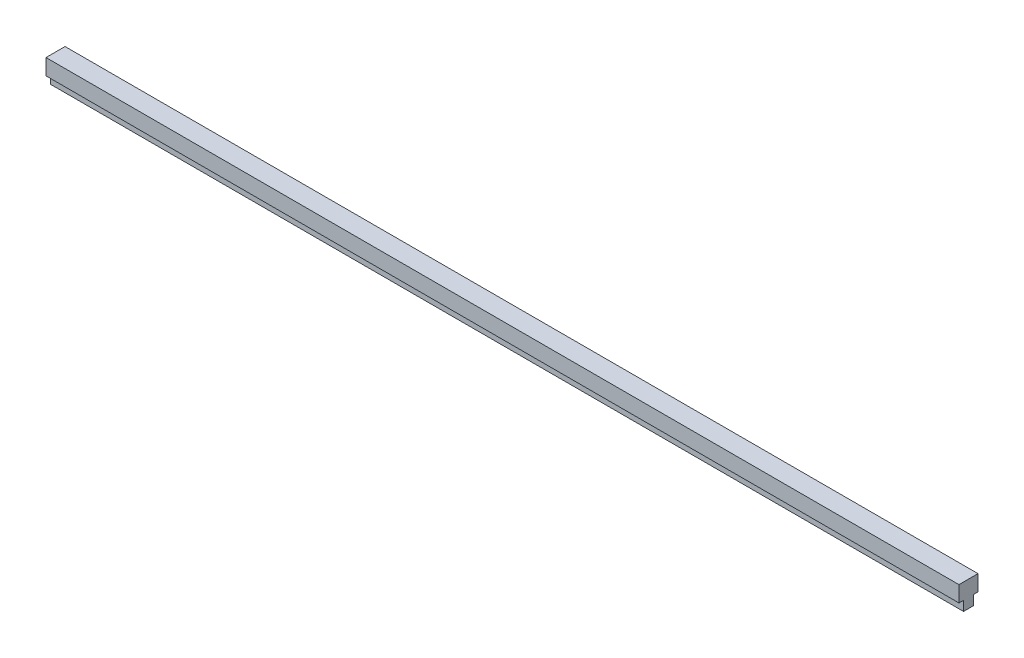
ISO-10303-21;
HEADER;
FILE_DESCRIPTION(('STEP AP214'),'2;1');
FILE_NAME('part.step','',(''),(''),'','','');
FILE_SCHEMA(('AUTOMOTIVE_DESIGN { 1 0 10303 214 1 1 1 1 }'));
ENDSEC;
DATA;
#1=APPLICATION_CONTEXT('core data for automotive mechanical design processes');
#2=APPLICATION_PROTOCOL_DEFINITION('international standard','automotive_design',2000,#1);
#3=PRODUCT_CONTEXT('',#1,'mechanical');
#4=PRODUCT('Part','Part','',(#3));
#5=PRODUCT_RELATED_PRODUCT_CATEGORY('part','',(#4));
#6=PRODUCT_DEFINITION_FORMATION('','',#4);
#7=PRODUCT_DEFINITION_CONTEXT('part definition',#1,'design');
#8=PRODUCT_DEFINITION('design','',#6,#7);
#9=PRODUCT_DEFINITION_SHAPE('','',#8);
#10=(LENGTH_UNIT() NAMED_UNIT(*) SI_UNIT(.MILLI.,.METRE.));
#11=(NAMED_UNIT(*) PLANE_ANGLE_UNIT() SI_UNIT($,.RADIAN.));
#12=(NAMED_UNIT(*) SI_UNIT($,.STERADIAN.) SOLID_ANGLE_UNIT());
#13=UNCERTAINTY_MEASURE_WITH_UNIT(LENGTH_MEASURE(1.E-05),#10,'distance_accuracy_value','');
#14=(GEOMETRIC_REPRESENTATION_CONTEXT(3) GLOBAL_UNCERTAINTY_ASSIGNED_CONTEXT((#13)) GLOBAL_UNIT_ASSIGNED_CONTEXT((#10,
#11,#12)) REPRESENTATION_CONTEXT('',''));
#15=CARTESIAN_POINT('',(0.,0.,0.));
#16=DIRECTION('',(0.,0.,1.));
#17=DIRECTION('',(1.,0.,0.));
#18=AXIS2_PLACEMENT_3D('',#15,#16,#17);
#19=CARTESIAN_POINT('',(575.,0.,0.));
#20=DIRECTION('',(0.,0.,1.));
#21=DIRECTION('',(1.,0.,0.));
#22=AXIS2_PLACEMENT_3D('',#19,#20,#21);
#23=PLANE('',#22);
#24=DIRECTION('',(0.,1.,0.));
#25=VECTOR('',#24,1.);
#26=CARTESIAN_POINT('',(0.,0.,0.));
#27=LINE('',#26,#25);
#28=CARTESIAN_POINT('',(0.,0.,0.));
#29=VERTEX_POINT('',#28);
#30=CARTESIAN_POINT('',(0.,6.1,0.));
#31=VERTEX_POINT('',#30);
#32=EDGE_CURVE('E144',#29,#31,#27,.T.);
#33=ORIENTED_EDGE('',*,*,#32,.T.);
#34=DIRECTION('',(-1.,0.,0.));
#35=VECTOR('',#34,1.);
#36=CARTESIAN_POINT('',(575.,6.1,0.));
#37=LINE('',#36,#35);
#38=CARTESIAN_POINT('',(575.,6.1,0.));
#39=VERTEX_POINT('',#38);
#40=EDGE_CURVE('E11',#39,#31,#37,.T.);
#41=ORIENTED_EDGE('',*,*,#40,.F.);
#42=DIRECTION('',(0.,1.,0.));
#43=VECTOR('',#42,1.);
#44=CARTESIAN_POINT('',(575.,0.,0.));
#45=LINE('',#44,#43);
#46=CARTESIAN_POINT('',(575.,0.,0.));
#47=VERTEX_POINT('',#46);
#48=EDGE_CURVE('E166',#47,#39,#45,.T.);
#49=ORIENTED_EDGE('',*,*,#48,.F.);
#50=DIRECTION('',(-1.,0.,0.));
#51=VECTOR('',#50,1.);
#52=CARTESIAN_POINT('',(575.,0.,0.));
#53=LINE('',#52,#51);
#54=EDGE_CURVE('E140',#47,#29,#53,.T.);
#55=ORIENTED_EDGE('',*,*,#54,.T.);
#56=EDGE_LOOP('',(#33,#41,#49,#55));
#57=FACE_BOUND('',#56,.T.);
#58=ADVANCED_FACE('F43',(#57),#23,.F.);
#59=CARTESIAN_POINT('',(575.,6.1,0.));
#60=DIRECTION('',(0.,1.,0.));
#61=DIRECTION('',(0.,0.,1.));
#62=AXIS2_PLACEMENT_3D('',#59,#60,#61);
#63=PLANE('',#62);
#64=DIRECTION('',(0.,0.,-1.));
#65=VECTOR('',#64,1.);
#66=CARTESIAN_POINT('',(0.,6.1,0.));
#67=LINE('',#66,#65);
#68=CARTESIAN_POINT('',(0.,6.1,-2.9));
#69=VERTEX_POINT('',#68);
#70=EDGE_CURVE('E148',#31,#69,#67,.T.);
#71=ORIENTED_EDGE('',*,*,#70,.T.);
#72=DIRECTION('',(-1.,0.,0.));
#73=VECTOR('',#72,1.);
#74=CARTESIAN_POINT('',(575.,6.1,-2.9));
#75=LINE('',#74,#73);
#76=CARTESIAN_POINT('',(575.,6.1,-2.9));
#77=VERTEX_POINT('',#76);
#78=EDGE_CURVE('E52',#77,#69,#75,.T.);
#79=ORIENTED_EDGE('',*,*,#78,.F.);
#80=DIRECTION('',(0.,0.,-1.));
#81=VECTOR('',#80,1.);
#82=CARTESIAN_POINT('',(575.,6.1,0.));
#83=LINE('',#82,#81);
#84=EDGE_CURVE('E103',#39,#77,#83,.T.);
#85=ORIENTED_EDGE('',*,*,#84,.F.);
#86=ORIENTED_EDGE('',*,*,#40,.T.);
#87=EDGE_LOOP('',(#71,#79,#85,#86));
#88=FACE_BOUND('',#87,.T.);
#89=ADVANCED_FACE('F212',(#88),#63,.F.);
#90=CARTESIAN_POINT('',(575.,6.1,-2.9));
#91=DIRECTION('',(0.,0.,1.));
#92=DIRECTION('',(1.,0.,0.));
#93=AXIS2_PLACEMENT_3D('',#90,#91,#92);
#94=PLANE('',#93);
#95=DIRECTION('',(0.,1.,0.));
#96=VECTOR('',#95,1.);
#97=CARTESIAN_POINT('',(0.,6.1,-2.9));
#98=LINE('',#97,#96);
#99=CARTESIAN_POINT('',(0.,16.1,-2.9));
#100=VERTEX_POINT('',#99);
#101=EDGE_CURVE('E151',#69,#100,#98,.T.);
#102=ORIENTED_EDGE('',*,*,#101,.T.);
#103=DIRECTION('',(-1.,0.,0.));
#104=VECTOR('',#103,1.);
#105=CARTESIAN_POINT('',(575.,16.1,-2.9));
#106=LINE('',#105,#104);
#107=CARTESIAN_POINT('',(575.,16.1,-2.9));
#108=VERTEX_POINT('',#107);
#109=EDGE_CURVE('E177',#108,#100,#106,.T.);
#110=ORIENTED_EDGE('',*,*,#109,.F.);
#111=DIRECTION('',(0.,1.,0.));
#112=VECTOR('',#111,1.);
#113=CARTESIAN_POINT('',(575.,6.1,-2.9));
#114=LINE('',#113,#112);
#115=EDGE_CURVE('E187',#77,#108,#114,.T.);
#116=ORIENTED_EDGE('',*,*,#115,.F.);
#117=ORIENTED_EDGE('',*,*,#78,.T.);
#118=EDGE_LOOP('',(#102,#110,#116,#117));
#119=FACE_BOUND('',#118,.T.);
#120=ADVANCED_FACE('F185',(#119),#94,.F.);
#121=CARTESIAN_POINT('',(575.,16.1,-2.9));
#122=DIRECTION('',(0.,-1.,0.));
#123=DIRECTION('',(0.,0.,-1.));
#124=AXIS2_PLACEMENT_3D('',#121,#122,#123);
#125=PLANE('',#124);
#126=DIRECTION('',(0.,0.,1.));
#127=VECTOR('',#126,1.);
#128=CARTESIAN_POINT('',(0.,16.1,-2.9));
#129=LINE('',#128,#127);
#130=CARTESIAN_POINT('',(0.,16.1,9.1));
#131=VERTEX_POINT('',#130);
#132=EDGE_CURVE('E154',#100,#131,#129,.T.);
#133=ORIENTED_EDGE('',*,*,#132,.T.);
#134=DIRECTION('',(-1.,0.,0.));
#135=VECTOR('',#134,1.);
#136=CARTESIAN_POINT('',(575.,16.1,9.1));
#137=LINE('',#136,#135);
#138=CARTESIAN_POINT('',(575.,16.1,9.1));
#139=VERTEX_POINT('',#138);
#140=EDGE_CURVE('E173',#139,#131,#137,.T.);
#141=ORIENTED_EDGE('',*,*,#140,.F.);
#142=DIRECTION('',(0.,0.,1.));
#143=VECTOR('',#142,1.);
#144=CARTESIAN_POINT('',(575.,16.1,-2.9));
#145=LINE('',#144,#143);
#146=EDGE_CURVE('E200',#108,#139,#145,.T.);
#147=ORIENTED_EDGE('',*,*,#146,.F.);
#148=ORIENTED_EDGE('',*,*,#109,.T.);
#149=EDGE_LOOP('',(#133,#141,#147,#148));
#150=FACE_BOUND('',#149,.T.);
#151=ADVANCED_FACE('F195',(#150),#125,.F.);
#152=CARTESIAN_POINT('',(575.,16.1,9.1));
#153=DIRECTION('',(0.,0.,-1.));
#154=DIRECTION('',(-1.,0.,0.));
#155=AXIS2_PLACEMENT_3D('',#152,#153,#154);
#156=PLANE('',#155);
#157=DIRECTION('',(0.,-1.,0.));
#158=VECTOR('',#157,1.);
#159=CARTESIAN_POINT('',(0.,16.1,9.1));
#160=LINE('',#159,#158);
#161=CARTESIAN_POINT('',(0.,6.1,9.1));
#162=VERTEX_POINT('',#161);
#163=EDGE_CURVE('E157',#131,#162,#160,.T.);
#164=ORIENTED_EDGE('',*,*,#163,.T.);
#165=DIRECTION('',(-1.,0.,0.));
#166=VECTOR('',#165,1.);
#167=CARTESIAN_POINT('',(575.,6.1,9.1));
#168=LINE('',#167,#166);
#169=CARTESIAN_POINT('',(575.,6.1,9.1));
#170=VERTEX_POINT('',#169);
#171=EDGE_CURVE('E133',#170,#162,#168,.T.);
#172=ORIENTED_EDGE('',*,*,#171,.F.);
#173=DIRECTION('',(0.,-1.,0.));
#174=VECTOR('',#173,1.);
#175=CARTESIAN_POINT('',(575.,16.1,9.1));
#176=LINE('',#175,#174);
#177=EDGE_CURVE('E122',#139,#170,#176,.T.);
#178=ORIENTED_EDGE('',*,*,#177,.F.);
#179=ORIENTED_EDGE('',*,*,#140,.T.);
#180=EDGE_LOOP('',(#164,#172,#178,#179));
#181=FACE_BOUND('',#180,.T.);
#182=ADVANCED_FACE('F198',(#181),#156,.F.);
#183=CARTESIAN_POINT('',(575.,6.1,9.1));
#184=DIRECTION('',(0.,1.,0.));
#185=DIRECTION('',(0.,0.,1.));
#186=AXIS2_PLACEMENT_3D('',#183,#184,#185);
#187=PLANE('',#186);
#188=DIRECTION('',(0.,0.,-1.));
#189=VECTOR('',#188,1.);
#190=CARTESIAN_POINT('',(0.,6.1,9.1));
#191=LINE('',#190,#189);
#192=CARTESIAN_POINT('',(0.,6.1,6.2));
#193=VERTEX_POINT('',#192);
#194=EDGE_CURVE('E131',#162,#193,#191,.T.);
#195=ORIENTED_EDGE('',*,*,#194,.T.);
#196=DIRECTION('',(-1.,0.,0.));
#197=VECTOR('',#196,1.);
#198=CARTESIAN_POINT('',(575.,6.1,6.2));
#199=LINE('',#198,#197);
#200=CARTESIAN_POINT('',(575.,6.1,6.2));
#201=VERTEX_POINT('',#200);
#202=EDGE_CURVE('E128',#201,#193,#199,.T.);
#203=ORIENTED_EDGE('',*,*,#202,.F.);
#204=DIRECTION('',(0.,0.,-1.));
#205=VECTOR('',#204,1.);
#206=CARTESIAN_POINT('',(575.,6.1,9.1));
#207=LINE('',#206,#205);
#208=EDGE_CURVE('E116',#170,#201,#207,.T.);
#209=ORIENTED_EDGE('',*,*,#208,.F.);
#210=ORIENTED_EDGE('',*,*,#171,.T.);
#211=EDGE_LOOP('',(#195,#203,#209,#210));
#212=FACE_BOUND('',#211,.T.);
#213=ADVANCED_FACE('F129',(#212),#187,.F.);
#214=CARTESIAN_POINT('',(575.,0.,6.2));
#215=DIRECTION('',(0.,0.,-1.));
#216=DIRECTION('',(-1.,0.,0.));
#217=AXIS2_PLACEMENT_3D('',#214,#215,#216);
#218=PLANE('',#217);
#219=DIRECTION('',(0.,-1.,0.));
#220=VECTOR('',#219,1.);
#221=CARTESIAN_POINT('',(0.,0.,6.2));
#222=LINE('',#221,#220);
#223=CARTESIAN_POINT('',(0.,0.,6.2));
#224=VERTEX_POINT('',#223);
#225=EDGE_CURVE('E89',#193,#224,#222,.T.);
#226=ORIENTED_EDGE('',*,*,#225,.T.);
#227=DIRECTION('',(-1.,0.,0.));
#228=VECTOR('',#227,1.);
#229=CARTESIAN_POINT('',(575.,0.,6.2));
#230=LINE('',#229,#228);
#231=CARTESIAN_POINT('',(575.,0.,6.2));
#232=VERTEX_POINT('',#231);
#233=EDGE_CURVE('E134',#232,#224,#230,.T.);
#234=ORIENTED_EDGE('',*,*,#233,.F.);
#235=DIRECTION('',(0.,-1.,0.));
#236=VECTOR('',#235,1.);
#237=CARTESIAN_POINT('',(575.,0.,6.2));
#238=LINE('',#237,#236);
#239=EDGE_CURVE('E120',#201,#232,#238,.T.);
#240=ORIENTED_EDGE('',*,*,#239,.F.);
#241=ORIENTED_EDGE('',*,*,#202,.T.);
#242=EDGE_LOOP('',(#226,#234,#240,#241));
#243=FACE_BOUND('',#242,.T.);
#244=ADVANCED_FACE('F136',(#243),#218,.F.);
#245=CARTESIAN_POINT('',(575.,0.,0.));
#246=DIRECTION('',(0.,1.,0.));
#247=DIRECTION('',(0.,0.,1.));
#248=AXIS2_PLACEMENT_3D('',#245,#246,#247);
#249=PLANE('',#248);
#250=DIRECTION('',(0.,0.,-1.));
#251=VECTOR('',#250,1.);
#252=CARTESIAN_POINT('',(0.,0.,0.));
#253=LINE('',#252,#251);
#254=EDGE_CURVE('E95',#224,#29,#253,.T.);
#255=ORIENTED_EDGE('',*,*,#254,.T.);
#256=ORIENTED_EDGE('',*,*,#54,.F.);
#257=DIRECTION('',(0.,0.,-1.));
#258=VECTOR('',#257,1.);
#259=CARTESIAN_POINT('',(575.,0.,0.));
#260=LINE('',#259,#258);
#261=EDGE_CURVE('E60',#232,#47,#260,.T.);
#262=ORIENTED_EDGE('',*,*,#261,.F.);
#263=ORIENTED_EDGE('',*,*,#233,.T.);
#264=EDGE_LOOP('',(#255,#256,#262,#263));
#265=FACE_BOUND('',#264,.T.);
#266=ADVANCED_FACE('F228',(#265),#249,.F.);
#267=CARTESIAN_POINT('',(575.,0.,0.));
#268=DIRECTION('',(-1.,0.,0.));
#269=DIRECTION('',(0.,0.,1.));
#270=AXIS2_PLACEMENT_3D('',#267,#268,#269);
#271=PLANE('',#270);
#272=ORIENTED_EDGE('',*,*,#48,.T.);
#273=ORIENTED_EDGE('',*,*,#84,.T.);
#274=ORIENTED_EDGE('',*,*,#115,.T.);
#275=ORIENTED_EDGE('',*,*,#146,.T.);
#276=ORIENTED_EDGE('',*,*,#177,.T.);
#277=ORIENTED_EDGE('',*,*,#208,.T.);
#278=ORIENTED_EDGE('',*,*,#239,.T.);
#279=ORIENTED_EDGE('',*,*,#261,.T.);
#280=EDGE_LOOP('',(#272,#273,#274,#275,#276,#277,#278,#279));
#281=FACE_BOUND('',#280,.T.);
#282=ADVANCED_FACE('F118',(#281),#271,.F.);
#283=CARTESIAN_POINT('',(0.,0.,0.));
#284=DIRECTION('',(-1.,0.,0.));
#285=DIRECTION('',(0.,0.,1.));
#286=AXIS2_PLACEMENT_3D('',#283,#284,#285);
#287=PLANE('',#286);
#288=ORIENTED_EDGE('',*,*,#32,.F.);
#289=ORIENTED_EDGE('',*,*,#254,.F.);
#290=ORIENTED_EDGE('',*,*,#225,.F.);
#291=ORIENTED_EDGE('',*,*,#194,.F.);
#292=ORIENTED_EDGE('',*,*,#163,.F.);
#293=ORIENTED_EDGE('',*,*,#132,.F.);
#294=ORIENTED_EDGE('',*,*,#101,.F.);
#295=ORIENTED_EDGE('',*,*,#70,.F.);
#296=EDGE_LOOP('',(#288,#289,#290,#291,#292,#293,#294,#295));
#297=FACE_BOUND('',#296,.T.);
#298=ADVANCED_FACE('F191',(#297),#287,.T.);
#299=CLOSED_SHELL('',(#58,#89,#120,#151,#182,#213,#244,#266,#282,#298));
#300=MANIFOLD_SOLID_BREP('B2',#299);
#301=ADVANCED_BREP_SHAPE_REPRESENTATION('',(#18,#300),#14);
#302=SHAPE_DEFINITION_REPRESENTATION(#9,#301);
ENDSEC;
END-ISO-10303-21;
